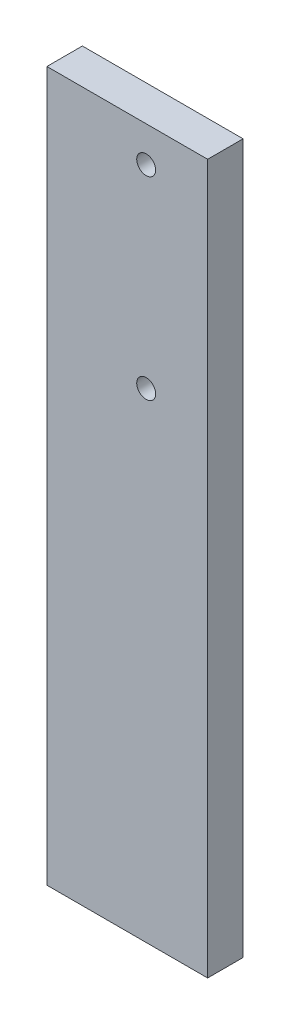
ISO-10303-21;
HEADER;
FILE_DESCRIPTION(('STEP AP214'),'2;1');
FILE_NAME('part.step','',(''),(''),'','','');
FILE_SCHEMA(('AUTOMOTIVE_DESIGN { 1 0 10303 214 1 1 1 1 }'));
ENDSEC;
DATA;
#1=APPLICATION_CONTEXT('core data for automotive mechanical design processes');
#2=APPLICATION_PROTOCOL_DEFINITION('international standard','automotive_design',2000,#1);
#3=PRODUCT_CONTEXT('',#1,'mechanical');
#4=PRODUCT('Part','Part','',(#3));
#5=PRODUCT_RELATED_PRODUCT_CATEGORY('part','',(#4));
#6=PRODUCT_DEFINITION_FORMATION('','',#4);
#7=PRODUCT_DEFINITION_CONTEXT('part definition',#1,'design');
#8=PRODUCT_DEFINITION('design','',#6,#7);
#9=PRODUCT_DEFINITION_SHAPE('','',#8);
#10=(LENGTH_UNIT() NAMED_UNIT(*) SI_UNIT(.MILLI.,.METRE.));
#11=(NAMED_UNIT(*) PLANE_ANGLE_UNIT() SI_UNIT($,.RADIAN.));
#12=(NAMED_UNIT(*) SI_UNIT($,.STERADIAN.) SOLID_ANGLE_UNIT());
#13=UNCERTAINTY_MEASURE_WITH_UNIT(LENGTH_MEASURE(1.E-05),#10,'distance_accuracy_value','');
#14=(GEOMETRIC_REPRESENTATION_CONTEXT(3) GLOBAL_UNCERTAINTY_ASSIGNED_CONTEXT((#13)) GLOBAL_UNIT_ASSIGNED_CONTEXT((#10,
#11,#12)) REPRESENTATION_CONTEXT('',''));
#15=CARTESIAN_POINT('',(0.,0.,0.));
#16=DIRECTION('',(0.,0.,1.));
#17=DIRECTION('',(1.,0.,0.));
#18=AXIS2_PLACEMENT_3D('',#15,#16,#17);
#19=CARTESIAN_POINT('',(0.,0.,15.));
#20=DIRECTION('',(0.,0.,-1.));
#21=DIRECTION('',(-1.,0.,0.));
#22=AXIS2_PLACEMENT_3D('',#19,#20,#21);
#23=PLANE('',#22);
#24=CARTESIAN_POINT('',(42.,285.,15.));
#25=DIRECTION('',(0.,0.,1.));
#26=DIRECTION('',(1.,0.,0.));
#27=AXIS2_PLACEMENT_3D('',#24,#25,#26);
#28=CIRCLE('',#27,4.00000000000001);
#29=CARTESIAN_POINT('',(46.,285.,15.));
#30=VERTEX_POINT('',#29);
#31=EDGE_CURVE('E100',#30,#30,#28,.T.);
#32=ORIENTED_EDGE('',*,*,#31,.F.);
#33=EDGE_LOOP('',(#32));
#34=FACE_BOUND('',#33,.T.);
#35=DIRECTION('',(0.,-1.,0.));
#36=VECTOR('',#35,1.);
#37=CARTESIAN_POINT('',(0.,0.,15.));
#38=LINE('',#37,#36);
#39=CARTESIAN_POINT('',(0.,300.,15.));
#40=VERTEX_POINT('',#39);
#41=CARTESIAN_POINT('',(0.,0.,15.));
#42=VERTEX_POINT('',#41);
#43=EDGE_CURVE('E85',#40,#42,#38,.T.);
#44=ORIENTED_EDGE('',*,*,#43,.T.);
#45=DIRECTION('',(1.,0.,0.));
#46=VECTOR('',#45,1.);
#47=CARTESIAN_POINT('',(0.,0.,15.));
#48=LINE('',#47,#46);
#49=CARTESIAN_POINT('',(68.,0.,15.));
#50=VERTEX_POINT('',#49);
#51=EDGE_CURVE('E80',#42,#50,#48,.T.);
#52=ORIENTED_EDGE('',*,*,#51,.T.);
#53=DIRECTION('',(0.,1.,0.));
#54=VECTOR('',#53,1.);
#55=CARTESIAN_POINT('',(68.,0.,15.));
#56=LINE('',#55,#54);
#57=CARTESIAN_POINT('',(68.,300.,15.));
#58=VERTEX_POINT('',#57);
#59=EDGE_CURVE('E83',#50,#58,#56,.T.);
#60=ORIENTED_EDGE('',*,*,#59,.T.);
#61=DIRECTION('',(-1.,0.,0.));
#62=VECTOR('',#61,1.);
#63=CARTESIAN_POINT('',(0.,300.,15.));
#64=LINE('',#63,#62);
#65=EDGE_CURVE('E50',#58,#40,#64,.T.);
#66=ORIENTED_EDGE('',*,*,#65,.T.);
#67=EDGE_LOOP('',(#44,#52,#60,#66));
#68=FACE_BOUND('',#67,.T.);
#69=CARTESIAN_POINT('',(42.,203.,15.));
#70=DIRECTION('',(0.,0.,1.));
#71=DIRECTION('',(1.,0.,0.));
#72=AXIS2_PLACEMENT_3D('',#69,#70,#71);
#73=CIRCLE('',#72,4.00000000000001);
#74=CARTESIAN_POINT('',(46.,203.,15.));
#75=VERTEX_POINT('',#74);
#76=EDGE_CURVE('E115',#75,#75,#73,.T.);
#77=ORIENTED_EDGE('',*,*,#76,.F.);
#78=EDGE_LOOP('',(#77));
#79=FACE_BOUND('',#78,.T.);
#80=ADVANCED_FACE('F33',(#34,#68,#79),#23,.F.);
#81=CARTESIAN_POINT('',(0.,0.,0.));
#82=DIRECTION('',(0.,0.,-1.));
#83=DIRECTION('',(-1.,0.,0.));
#84=AXIS2_PLACEMENT_3D('',#81,#82,#83);
#85=PLANE('',#84);
#86=CARTESIAN_POINT('',(42.,285.,0.));
#87=DIRECTION('',(0.,0.,1.));
#88=DIRECTION('',(1.,0.,0.));
#89=AXIS2_PLACEMENT_3D('',#86,#87,#88);
#90=CIRCLE('',#89,4.00000000000001);
#91=CARTESIAN_POINT('',(46.,285.,0.));
#92=VERTEX_POINT('',#91);
#93=EDGE_CURVE('E112',#92,#92,#90,.T.);
#94=ORIENTED_EDGE('',*,*,#93,.T.);
#95=EDGE_LOOP('',(#94));
#96=FACE_BOUND('',#95,.T.);
#97=DIRECTION('',(0.,-1.,0.));
#98=VECTOR('',#97,1.);
#99=CARTESIAN_POINT('',(0.,0.,0.));
#100=LINE('',#99,#98);
#101=CARTESIAN_POINT('',(0.,300.,0.));
#102=VERTEX_POINT('',#101);
#103=CARTESIAN_POINT('',(0.,0.,0.));
#104=VERTEX_POINT('',#103);
#105=EDGE_CURVE('E97',#102,#104,#100,.T.);
#106=ORIENTED_EDGE('',*,*,#105,.F.);
#107=DIRECTION('',(-1.,0.,0.));
#108=VECTOR('',#107,1.);
#109=CARTESIAN_POINT('',(0.,300.,0.));
#110=LINE('',#109,#108);
#111=CARTESIAN_POINT('',(68.,300.,0.));
#112=VERTEX_POINT('',#111);
#113=EDGE_CURVE('E73',#112,#102,#110,.T.);
#114=ORIENTED_EDGE('',*,*,#113,.F.);
#115=DIRECTION('',(0.,1.,0.));
#116=VECTOR('',#115,1.);
#117=CARTESIAN_POINT('',(68.,0.,0.));
#118=LINE('',#117,#116);
#119=CARTESIAN_POINT('',(68.,0.,0.));
#120=VERTEX_POINT('',#119);
#121=EDGE_CURVE('E67',#120,#112,#118,.T.);
#122=ORIENTED_EDGE('',*,*,#121,.F.);
#123=DIRECTION('',(1.,0.,0.));
#124=VECTOR('',#123,1.);
#125=CARTESIAN_POINT('',(0.,0.,0.));
#126=LINE('',#125,#124);
#127=EDGE_CURVE('E89',#104,#120,#126,.T.);
#128=ORIENTED_EDGE('',*,*,#127,.F.);
#129=EDGE_LOOP('',(#106,#114,#122,#128));
#130=FACE_BOUND('',#129,.T.);
#131=CARTESIAN_POINT('',(42.,203.,0.));
#132=DIRECTION('',(0.,0.,1.));
#133=DIRECTION('',(1.,0.,0.));
#134=AXIS2_PLACEMENT_3D('',#131,#132,#133);
#135=CIRCLE('',#134,4.00000000000001);
#136=CARTESIAN_POINT('',(46.,203.,0.));
#137=VERTEX_POINT('',#136);
#138=EDGE_CURVE('E118',#137,#137,#135,.T.);
#139=ORIENTED_EDGE('',*,*,#138,.T.);
#140=EDGE_LOOP('',(#139));
#141=FACE_BOUND('',#140,.T.);
#142=ADVANCED_FACE('F108',(#96,#130,#141),#85,.T.);
#143=CARTESIAN_POINT('',(0.,0.,15.));
#144=DIRECTION('',(1.,0.,0.));
#145=DIRECTION('',(0.,0.,-1.));
#146=AXIS2_PLACEMENT_3D('',#143,#144,#145);
#147=PLANE('',#146);
#148=ORIENTED_EDGE('',*,*,#105,.T.);
#149=DIRECTION('',(0.,0.,-1.));
#150=VECTOR('',#149,1.);
#151=CARTESIAN_POINT('',(0.,0.,15.));
#152=LINE('',#151,#150);
#153=EDGE_CURVE('E11',#42,#104,#152,.T.);
#154=ORIENTED_EDGE('',*,*,#153,.F.);
#155=ORIENTED_EDGE('',*,*,#43,.F.);
#156=DIRECTION('',(0.,0.,-1.));
#157=VECTOR('',#156,1.);
#158=CARTESIAN_POINT('',(0.,300.,15.));
#159=LINE('',#158,#157);
#160=EDGE_CURVE('E93',#40,#102,#159,.T.);
#161=ORIENTED_EDGE('',*,*,#160,.T.);
#162=EDGE_LOOP('',(#148,#154,#155,#161));
#163=FACE_BOUND('',#162,.T.);
#164=ADVANCED_FACE('F35',(#163),#147,.F.);
#165=CARTESIAN_POINT('',(0.,0.,15.));
#166=DIRECTION('',(0.,1.,0.));
#167=DIRECTION('',(0.,0.,1.));
#168=AXIS2_PLACEMENT_3D('',#165,#166,#167);
#169=PLANE('',#168);
#170=ORIENTED_EDGE('',*,*,#127,.T.);
#171=DIRECTION('',(0.,0.,-1.));
#172=VECTOR('',#171,1.);
#173=CARTESIAN_POINT('',(68.,0.,15.));
#174=LINE('',#173,#172);
#175=EDGE_CURVE('E42',#50,#120,#174,.T.);
#176=ORIENTED_EDGE('',*,*,#175,.F.);
#177=ORIENTED_EDGE('',*,*,#51,.F.);
#178=ORIENTED_EDGE('',*,*,#153,.T.);
#179=EDGE_LOOP('',(#170,#176,#177,#178));
#180=FACE_BOUND('',#179,.T.);
#181=ADVANCED_FACE('F88',(#180),#169,.F.);
#182=CARTESIAN_POINT('',(68.,0.,15.));
#183=DIRECTION('',(-1.,0.,0.));
#184=DIRECTION('',(0.,0.,1.));
#185=AXIS2_PLACEMENT_3D('',#182,#183,#184);
#186=PLANE('',#185);
#187=ORIENTED_EDGE('',*,*,#121,.T.);
#188=DIRECTION('',(0.,0.,-1.));
#189=VECTOR('',#188,1.);
#190=CARTESIAN_POINT('',(68.,300.,15.));
#191=LINE('',#190,#189);
#192=EDGE_CURVE('E90',#58,#112,#191,.T.);
#193=ORIENTED_EDGE('',*,*,#192,.F.);
#194=ORIENTED_EDGE('',*,*,#59,.F.);
#195=ORIENTED_EDGE('',*,*,#175,.T.);
#196=EDGE_LOOP('',(#187,#193,#194,#195));
#197=FACE_BOUND('',#196,.T.);
#198=ADVANCED_FACE('F91',(#197),#186,.F.);
#199=CARTESIAN_POINT('',(0.,300.,15.));
#200=DIRECTION('',(0.,-1.,0.));
#201=DIRECTION('',(0.,0.,-1.));
#202=AXIS2_PLACEMENT_3D('',#199,#200,#201);
#203=PLANE('',#202);
#204=ORIENTED_EDGE('',*,*,#113,.T.);
#205=ORIENTED_EDGE('',*,*,#160,.F.);
#206=ORIENTED_EDGE('',*,*,#65,.F.);
#207=ORIENTED_EDGE('',*,*,#192,.T.);
#208=EDGE_LOOP('',(#204,#205,#206,#207));
#209=FACE_BOUND('',#208,.T.);
#210=ADVANCED_FACE('F105',(#209),#203,.F.);
#211=CARTESIAN_POINT('',(42.,285.,15.));
#212=DIRECTION('',(0.,0.,-1.));
#213=DIRECTION('',(-1.,0.,0.));
#214=AXIS2_PLACEMENT_3D('',#211,#212,#213);
#215=CYLINDRICAL_SURFACE('',#214,4.00000000000001);
#216=ORIENTED_EDGE('',*,*,#31,.T.);
#217=EDGE_LOOP('',(#216));
#218=FACE_BOUND('',#217,.T.);
#219=ORIENTED_EDGE('',*,*,#93,.F.);
#220=EDGE_LOOP('',(#219));
#221=FACE_BOUND('',#220,.T.);
#222=ADVANCED_FACE('F136',(#218,#221),#215,.F.);
#223=CARTESIAN_POINT('',(42.,203.,15.));
#224=DIRECTION('',(0.,0.,-1.));
#225=DIRECTION('',(-1.,0.,0.));
#226=AXIS2_PLACEMENT_3D('',#223,#224,#225);
#227=CYLINDRICAL_SURFACE('',#226,4.00000000000001);
#228=ORIENTED_EDGE('',*,*,#76,.T.);
#229=EDGE_LOOP('',(#228));
#230=FACE_BOUND('',#229,.T.);
#231=ORIENTED_EDGE('',*,*,#138,.F.);
#232=EDGE_LOOP('',(#231));
#233=FACE_BOUND('',#232,.T.);
#234=ADVANCED_FACE('F124',(#230,#233),#227,.F.);
#235=CLOSED_SHELL('',(#80,#142,#164,#181,#198,#210,#222,#234));
#236=MANIFOLD_SOLID_BREP('B2',#235);
#237=ADVANCED_BREP_SHAPE_REPRESENTATION('',(#18,#236),#14);
#238=SHAPE_DEFINITION_REPRESENTATION(#9,#237);
ENDSEC;
END-ISO-10303-21;
